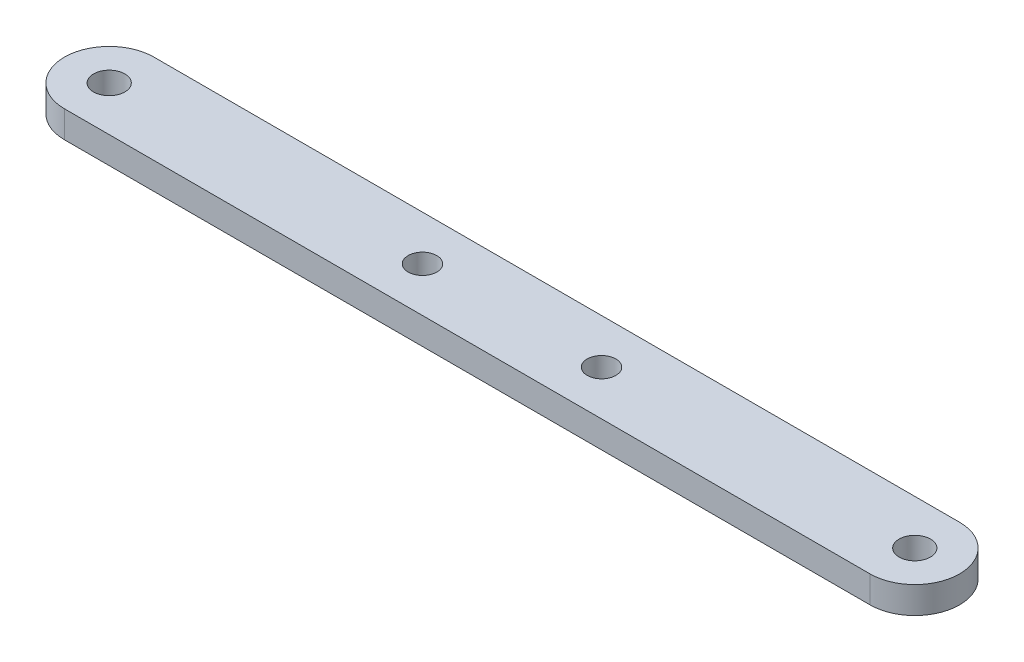
ISO-10303-21;
HEADER;
FILE_DESCRIPTION(('STEP AP214'),'2;1');
FILE_NAME('part.step','',(''),(''),'','','');
FILE_SCHEMA(('AUTOMOTIVE_DESIGN { 1 0 10303 214 1 1 1 1 }'));
ENDSEC;
DATA;
#1=APPLICATION_CONTEXT('core data for automotive mechanical design processes');
#2=APPLICATION_PROTOCOL_DEFINITION('international standard','automotive_design',2000,#1);
#3=PRODUCT_CONTEXT('',#1,'mechanical');
#4=PRODUCT('Part','Part','',(#3));
#5=PRODUCT_RELATED_PRODUCT_CATEGORY('part','',(#4));
#6=PRODUCT_DEFINITION_FORMATION('','',#4);
#7=PRODUCT_DEFINITION_CONTEXT('part definition',#1,'design');
#8=PRODUCT_DEFINITION('design','',#6,#7);
#9=PRODUCT_DEFINITION_SHAPE('','',#8);
#10=(LENGTH_UNIT() NAMED_UNIT(*) SI_UNIT(.MILLI.,.METRE.));
#11=(NAMED_UNIT(*) PLANE_ANGLE_UNIT() SI_UNIT($,.RADIAN.));
#12=(NAMED_UNIT(*) SI_UNIT($,.STERADIAN.) SOLID_ANGLE_UNIT());
#13=UNCERTAINTY_MEASURE_WITH_UNIT(LENGTH_MEASURE(1.E-05),#10,'distance_accuracy_value','');
#14=(GEOMETRIC_REPRESENTATION_CONTEXT(3) GLOBAL_UNCERTAINTY_ASSIGNED_CONTEXT((#13)) GLOBAL_UNIT_ASSIGNED_CONTEXT((#10,
#11,#12)) REPRESENTATION_CONTEXT('',''));
#15=CARTESIAN_POINT('',(0.,0.,0.));
#16=DIRECTION('',(0.,0.,1.));
#17=DIRECTION('',(1.,0.,0.));
#18=AXIS2_PLACEMENT_3D('',#15,#16,#17);
#19=CARTESIAN_POINT('',(-45.,3.,0.));
#20=DIRECTION('',(0.,1.,0.));
#21=DIRECTION('',(0.,0.,1.));
#22=AXIS2_PLACEMENT_3D('',#19,#20,#21);
#23=PLANE('',#22);
#24=CARTESIAN_POINT('',(-10.,3.,0.));
#25=DIRECTION('',(0.,1.,0.));
#26=DIRECTION('',(0.,0.,1.));
#27=AXIS2_PLACEMENT_3D('',#24,#25,#26);
#28=CIRCLE('',#27,1.6);
#29=CARTESIAN_POINT('',(-10.,3.,1.6));
#30=VERTEX_POINT('',#29);
#31=EDGE_CURVE('E121',#30,#30,#28,.T.);
#32=ORIENTED_EDGE('',*,*,#31,.F.);
#33=EDGE_LOOP('',(#32));
#34=FACE_BOUND('',#33,.T.);
#35=CARTESIAN_POINT('',(-45.,3.,0.));
#36=DIRECTION('',(0.,1.,0.));
#37=DIRECTION('',(0.,0.,1.));
#38=AXIS2_PLACEMENT_3D('',#35,#36,#37);
#39=CIRCLE('',#38,1.75);
#40=CARTESIAN_POINT('',(-45.,3.,1.75));
#41=VERTEX_POINT('',#40);
#42=EDGE_CURVE('E100',#41,#41,#39,.T.);
#43=ORIENTED_EDGE('',*,*,#42,.F.);
#44=EDGE_LOOP('',(#43));
#45=FACE_BOUND('',#44,.T.);
#46=CARTESIAN_POINT('',(-45.,3.,0.));
#47=DIRECTION('',(0.,1.,0.));
#48=DIRECTION('',(0.,0.,1.));
#49=AXIS2_PLACEMENT_3D('',#46,#47,#48);
#50=CIRCLE('',#49,5.00000000000002);
#51=CARTESIAN_POINT('',(-45.,3.,-5.00000000000002));
#52=VERTEX_POINT('',#51);
#53=CARTESIAN_POINT('',(-45.,3.,5.00000000000002));
#54=VERTEX_POINT('',#53);
#55=EDGE_CURVE('E85',#52,#54,#50,.T.);
#56=ORIENTED_EDGE('',*,*,#55,.T.);
#57=DIRECTION('',(1.,0.,0.));
#58=VECTOR('',#57,1.);
#59=CARTESIAN_POINT('',(-45.,3.,5.00000000000002));
#60=LINE('',#59,#58);
#61=CARTESIAN_POINT('',(45.,3.,5.));
#62=VERTEX_POINT('',#61);
#63=EDGE_CURVE('E80',#54,#62,#60,.T.);
#64=ORIENTED_EDGE('',*,*,#63,.T.);
#65=CARTESIAN_POINT('',(45.,3.,0.));
#66=DIRECTION('',(0.,1.,0.));
#67=DIRECTION('',(0.,0.,1.));
#68=AXIS2_PLACEMENT_3D('',#65,#66,#67);
#69=CIRCLE('',#68,5.00000000000002);
#70=CARTESIAN_POINT('',(45.,3.,-5.00000000000003));
#71=VERTEX_POINT('',#70);
#72=EDGE_CURVE('E83',#62,#71,#69,.T.);
#73=ORIENTED_EDGE('',*,*,#72,.T.);
#74=DIRECTION('',(-1.,0.,0.));
#75=VECTOR('',#74,1.);
#76=CARTESIAN_POINT('',(-45.,3.,-5.00000000000002));
#77=LINE('',#76,#75);
#78=EDGE_CURVE('E50',#71,#52,#77,.T.);
#79=ORIENTED_EDGE('',*,*,#78,.T.);
#80=EDGE_LOOP('',(#56,#64,#73,#79));
#81=FACE_BOUND('',#80,.T.);
#82=CARTESIAN_POINT('',(45.,3.,0.));
#83=DIRECTION('',(0.,1.,0.));
#84=DIRECTION('',(0.,0.,-1.));
#85=AXIS2_PLACEMENT_3D('',#82,#83,#84);
#86=CIRCLE('',#85,1.75);
#87=CARTESIAN_POINT('',(45.,3.,-1.75));
#88=VERTEX_POINT('',#87);
#89=EDGE_CURVE('E115',#88,#88,#86,.T.);
#90=ORIENTED_EDGE('',*,*,#89,.F.);
#91=EDGE_LOOP('',(#90));
#92=FACE_BOUND('',#91,.T.);
#93=CARTESIAN_POINT('',(10.,3.,0.));
#94=DIRECTION('',(0.,1.,0.));
#95=DIRECTION('',(0.,0.,-1.));
#96=AXIS2_PLACEMENT_3D('',#93,#94,#95);
#97=CIRCLE('',#96,1.6);
#98=CARTESIAN_POINT('',(10.,3.,-1.6));
#99=VERTEX_POINT('',#98);
#100=EDGE_CURVE('E127',#99,#99,#97,.T.);
#101=ORIENTED_EDGE('',*,*,#100,.F.);
#102=EDGE_LOOP('',(#101));
#103=FACE_BOUND('',#102,.T.);
#104=ADVANCED_FACE('F33',(#34,#45,#81,#92,#103),#23,.T.);
#105=CARTESIAN_POINT('',(-45.,0.,0.));
#106=DIRECTION('',(0.,1.,0.));
#107=DIRECTION('',(0.,0.,1.));
#108=AXIS2_PLACEMENT_3D('',#105,#106,#107);
#109=PLANE('',#108);
#110=CARTESIAN_POINT('',(-45.,0.,0.));
#111=DIRECTION('',(0.,1.,0.));
#112=DIRECTION('',(0.,0.,1.));
#113=AXIS2_PLACEMENT_3D('',#110,#111,#112);
#114=CIRCLE('',#113,5.00000000000002);
#115=CARTESIAN_POINT('',(-45.,0.,-5.00000000000002));
#116=VERTEX_POINT('',#115);
#117=CARTESIAN_POINT('',(-45.,0.,5.00000000000002));
#118=VERTEX_POINT('',#117);
#119=EDGE_CURVE('E97',#116,#118,#114,.T.);
#120=ORIENTED_EDGE('',*,*,#119,.F.);
#121=DIRECTION('',(-1.,0.,0.));
#122=VECTOR('',#121,1.);
#123=CARTESIAN_POINT('',(-45.,0.,-5.00000000000002));
#124=LINE('',#123,#122);
#125=CARTESIAN_POINT('',(45.,0.,-5.00000000000003));
#126=VERTEX_POINT('',#125);
#127=EDGE_CURVE('E73',#126,#116,#124,.T.);
#128=ORIENTED_EDGE('',*,*,#127,.F.);
#129=CARTESIAN_POINT('',(45.,0.,0.));
#130=DIRECTION('',(0.,1.,0.));
#131=DIRECTION('',(0.,0.,1.));
#132=AXIS2_PLACEMENT_3D('',#129,#130,#131);
#133=CIRCLE('',#132,5.00000000000002);
#134=CARTESIAN_POINT('',(45.,0.,5.));
#135=VERTEX_POINT('',#134);
#136=EDGE_CURVE('E67',#135,#126,#133,.T.);
#137=ORIENTED_EDGE('',*,*,#136,.F.);
#138=DIRECTION('',(1.,0.,0.));
#139=VECTOR('',#138,1.);
#140=CARTESIAN_POINT('',(-45.,0.,5.00000000000002));
#141=LINE('',#140,#139);
#142=EDGE_CURVE('E89',#118,#135,#141,.T.);
#143=ORIENTED_EDGE('',*,*,#142,.F.);
#144=EDGE_LOOP('',(#120,#128,#137,#143));
#145=FACE_BOUND('',#144,.T.);
#146=CARTESIAN_POINT('',(-45.,0.,0.));
#147=DIRECTION('',(0.,1.,0.));
#148=DIRECTION('',(0.,0.,1.));
#149=AXIS2_PLACEMENT_3D('',#146,#147,#148);
#150=CIRCLE('',#149,1.75);
#151=CARTESIAN_POINT('',(-45.,0.,1.75));
#152=VERTEX_POINT('',#151);
#153=EDGE_CURVE('E112',#152,#152,#150,.T.);
#154=ORIENTED_EDGE('',*,*,#153,.T.);
#155=EDGE_LOOP('',(#154));
#156=FACE_BOUND('',#155,.T.);
#157=CARTESIAN_POINT('',(45.,0.,0.));
#158=DIRECTION('',(0.,1.,0.));
#159=DIRECTION('',(0.,0.,-1.));
#160=AXIS2_PLACEMENT_3D('',#157,#158,#159);
#161=CIRCLE('',#160,1.75);
#162=CARTESIAN_POINT('',(45.,0.,-1.75));
#163=VERTEX_POINT('',#162);
#164=EDGE_CURVE('E118',#163,#163,#161,.T.);
#165=ORIENTED_EDGE('',*,*,#164,.T.);
#166=EDGE_LOOP('',(#165));
#167=FACE_BOUND('',#166,.T.);
#168=CARTESIAN_POINT('',(-10.,0.,0.));
#169=DIRECTION('',(0.,1.,0.));
#170=DIRECTION('',(0.,0.,1.));
#171=AXIS2_PLACEMENT_3D('',#168,#169,#170);
#172=CIRCLE('',#171,1.6);
#173=CARTESIAN_POINT('',(-10.,0.,1.6));
#174=VERTEX_POINT('',#173);
#175=EDGE_CURVE('E124',#174,#174,#172,.T.);
#176=ORIENTED_EDGE('',*,*,#175,.T.);
#177=EDGE_LOOP('',(#176));
#178=FACE_BOUND('',#177,.T.);
#179=CARTESIAN_POINT('',(10.,0.,0.));
#180=DIRECTION('',(0.,1.,0.));
#181=DIRECTION('',(0.,0.,-1.));
#182=AXIS2_PLACEMENT_3D('',#179,#180,#181);
#183=CIRCLE('',#182,1.6);
#184=CARTESIAN_POINT('',(10.,0.,-1.6));
#185=VERTEX_POINT('',#184);
#186=EDGE_CURVE('E130',#185,#185,#183,.T.);
#187=ORIENTED_EDGE('',*,*,#186,.T.);
#188=EDGE_LOOP('',(#187));
#189=FACE_BOUND('',#188,.T.);
#190=ADVANCED_FACE('F108',(#145,#156,#167,#178,#189),#109,.F.);
#191=CARTESIAN_POINT('',(-45.,3.,0.));
#192=DIRECTION('',(0.,-1.,0.));
#193=DIRECTION('',(0.,0.,-1.));
#194=AXIS2_PLACEMENT_3D('',#191,#192,#193);
#195=CYLINDRICAL_SURFACE('',#194,5.00000000000002);
#196=ORIENTED_EDGE('',*,*,#119,.T.);
#197=DIRECTION('',(0.,-1.,0.));
#198=VECTOR('',#197,1.);
#199=CARTESIAN_POINT('',(-45.,3.,5.00000000000002));
#200=LINE('',#199,#198);
#201=EDGE_CURVE('E11',#54,#118,#200,.T.);
#202=ORIENTED_EDGE('',*,*,#201,.F.);
#203=ORIENTED_EDGE('',*,*,#55,.F.);
#204=DIRECTION('',(0.,-1.,0.));
#205=VECTOR('',#204,1.);
#206=CARTESIAN_POINT('',(-45.,3.,-5.00000000000002));
#207=LINE('',#206,#205);
#208=EDGE_CURVE('E93',#52,#116,#207,.T.);
#209=ORIENTED_EDGE('',*,*,#208,.T.);
#210=EDGE_LOOP('',(#196,#202,#203,#209));
#211=FACE_BOUND('',#210,.T.);
#212=ADVANCED_FACE('F35',(#211),#195,.T.);
#213=CARTESIAN_POINT('',(-45.,3.,5.00000000000002));
#214=DIRECTION('',(0.,0.,-1.));
#215=DIRECTION('',(-1.,0.,0.));
#216=AXIS2_PLACEMENT_3D('',#213,#214,#215);
#217=PLANE('',#216);
#218=ORIENTED_EDGE('',*,*,#142,.T.);
#219=DIRECTION('',(0.,-1.,0.));
#220=VECTOR('',#219,1.);
#221=CARTESIAN_POINT('',(45.,3.,5.));
#222=LINE('',#221,#220);
#223=EDGE_CURVE('E42',#62,#135,#222,.T.);
#224=ORIENTED_EDGE('',*,*,#223,.F.);
#225=ORIENTED_EDGE('',*,*,#63,.F.);
#226=ORIENTED_EDGE('',*,*,#201,.T.);
#227=EDGE_LOOP('',(#218,#224,#225,#226));
#228=FACE_BOUND('',#227,.T.);
#229=ADVANCED_FACE('F88',(#228),#217,.F.);
#230=CARTESIAN_POINT('',(45.,3.,0.));
#231=DIRECTION('',(0.,-1.,0.));
#232=DIRECTION('',(0.,0.,-1.));
#233=AXIS2_PLACEMENT_3D('',#230,#231,#232);
#234=CYLINDRICAL_SURFACE('',#233,5.00000000000002);
#235=ORIENTED_EDGE('',*,*,#136,.T.);
#236=DIRECTION('',(0.,-1.,0.));
#237=VECTOR('',#236,1.);
#238=CARTESIAN_POINT('',(45.,3.,-5.00000000000003));
#239=LINE('',#238,#237);
#240=EDGE_CURVE('E90',#71,#126,#239,.T.);
#241=ORIENTED_EDGE('',*,*,#240,.F.);
#242=ORIENTED_EDGE('',*,*,#72,.F.);
#243=ORIENTED_EDGE('',*,*,#223,.T.);
#244=EDGE_LOOP('',(#235,#241,#242,#243));
#245=FACE_BOUND('',#244,.T.);
#246=ADVANCED_FACE('F91',(#245),#234,.T.);
#247=CARTESIAN_POINT('',(-45.,3.,-5.00000000000002));
#248=DIRECTION('',(0.,0.,1.));
#249=DIRECTION('',(1.,0.,0.));
#250=AXIS2_PLACEMENT_3D('',#247,#248,#249);
#251=PLANE('',#250);
#252=ORIENTED_EDGE('',*,*,#127,.T.);
#253=ORIENTED_EDGE('',*,*,#208,.F.);
#254=ORIENTED_EDGE('',*,*,#78,.F.);
#255=ORIENTED_EDGE('',*,*,#240,.T.);
#256=EDGE_LOOP('',(#252,#253,#254,#255));
#257=FACE_BOUND('',#256,.T.);
#258=ADVANCED_FACE('F105',(#257),#251,.F.);
#259=CARTESIAN_POINT('',(-45.,3.,0.));
#260=DIRECTION('',(0.,-1.,0.));
#261=DIRECTION('',(0.,0.,-1.));
#262=AXIS2_PLACEMENT_3D('',#259,#260,#261);
#263=CYLINDRICAL_SURFACE('',#262,1.75);
#264=ORIENTED_EDGE('',*,*,#42,.T.);
#265=EDGE_LOOP('',(#264));
#266=FACE_BOUND('',#265,.T.);
#267=ORIENTED_EDGE('',*,*,#153,.F.);
#268=EDGE_LOOP('',(#267));
#269=FACE_BOUND('',#268,.T.);
#270=ADVANCED_FACE('F149',(#266,#269),#263,.F.);
#271=CARTESIAN_POINT('',(45.,3.,0.));
#272=DIRECTION('',(0.,-1.,0.));
#273=DIRECTION('',(0.,0.,-1.));
#274=AXIS2_PLACEMENT_3D('',#271,#272,#273);
#275=CYLINDRICAL_SURFACE('',#274,1.75);
#276=ORIENTED_EDGE('',*,*,#89,.T.);
#277=EDGE_LOOP('',(#276));
#278=FACE_BOUND('',#277,.T.);
#279=ORIENTED_EDGE('',*,*,#164,.F.);
#280=EDGE_LOOP('',(#279));
#281=FACE_BOUND('',#280,.T.);
#282=ADVANCED_FACE('F195',(#278,#281),#275,.F.);
#283=CARTESIAN_POINT('',(-10.,3.,0.));
#284=DIRECTION('',(0.,-1.,0.));
#285=DIRECTION('',(0.,0.,-1.));
#286=AXIS2_PLACEMENT_3D('',#283,#284,#285);
#287=CYLINDRICAL_SURFACE('',#286,1.6);
#288=ORIENTED_EDGE('',*,*,#31,.T.);
#289=EDGE_LOOP('',(#288));
#290=FACE_BOUND('',#289,.T.);
#291=ORIENTED_EDGE('',*,*,#175,.F.);
#292=EDGE_LOOP('',(#291));
#293=FACE_BOUND('',#292,.T.);
#294=ADVANCED_FACE('F203',(#290,#293),#287,.F.);
#295=CARTESIAN_POINT('',(10.,3.,0.));
#296=DIRECTION('',(0.,-1.,0.));
#297=DIRECTION('',(0.,0.,-1.));
#298=AXIS2_PLACEMENT_3D('',#295,#296,#297);
#299=CYLINDRICAL_SURFACE('',#298,1.6);
#300=ORIENTED_EDGE('',*,*,#100,.T.);
#301=EDGE_LOOP('',(#300));
#302=FACE_BOUND('',#301,.T.);
#303=ORIENTED_EDGE('',*,*,#186,.F.);
#304=EDGE_LOOP('',(#303));
#305=FACE_BOUND('',#304,.T.);
#306=ADVANCED_FACE('F136',(#302,#305),#299,.F.);
#307=CLOSED_SHELL('',(#104,#190,#212,#229,#246,#258,#270,#282,#294,#306));
#308=MANIFOLD_SOLID_BREP('B2',#307);
#309=ADVANCED_BREP_SHAPE_REPRESENTATION('',(#18,#308),#14);
#310=SHAPE_DEFINITION_REPRESENTATION(#9,#309);
ENDSEC;
END-ISO-10303-21;
